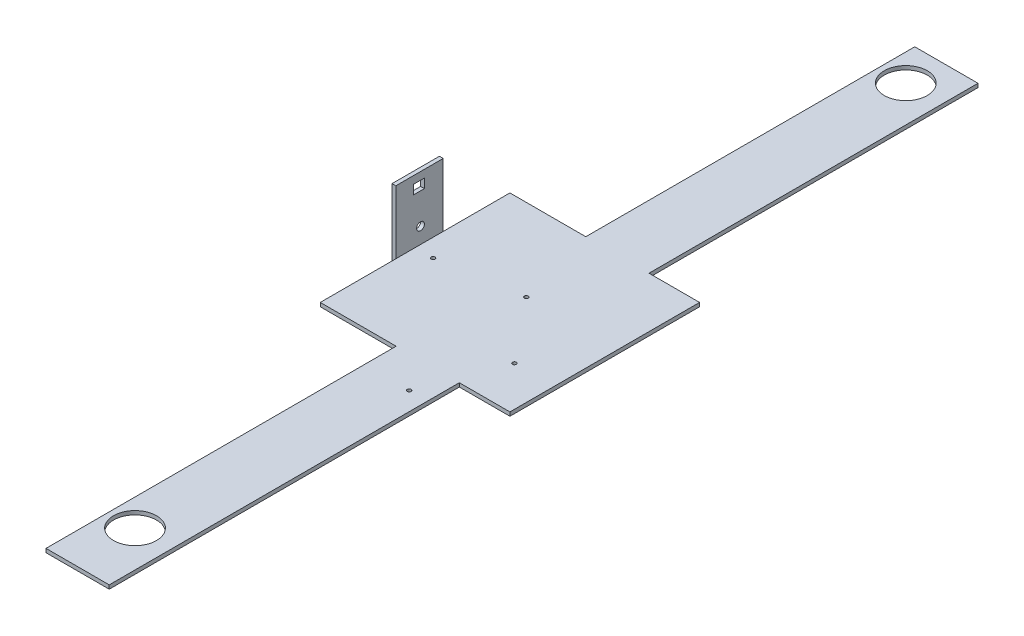
ISO-10303-21;
HEADER;
FILE_DESCRIPTION(('STEP AP214'),'2;1');
FILE_NAME('part.step','',(''),(''),'','','');
FILE_SCHEMA(('AUTOMOTIVE_DESIGN { 1 0 10303 214 1 1 1 1 }'));
ENDSEC;
DATA;
#1=APPLICATION_CONTEXT('core data for automotive mechanical design processes');
#2=APPLICATION_PROTOCOL_DEFINITION('international standard','automotive_design',2000,#1);
#3=PRODUCT_CONTEXT('',#1,'mechanical');
#4=PRODUCT('Part','Part','',(#3));
#5=PRODUCT_RELATED_PRODUCT_CATEGORY('part','',(#4));
#6=PRODUCT_DEFINITION_FORMATION('','',#4);
#7=PRODUCT_DEFINITION_CONTEXT('part definition',#1,'design');
#8=PRODUCT_DEFINITION('design','',#6,#7);
#9=PRODUCT_DEFINITION_SHAPE('','',#8);
#10=(LENGTH_UNIT() NAMED_UNIT(*) SI_UNIT(.MILLI.,.METRE.));
#11=(NAMED_UNIT(*) PLANE_ANGLE_UNIT() SI_UNIT($,.RADIAN.));
#12=(NAMED_UNIT(*) SI_UNIT($,.STERADIAN.) SOLID_ANGLE_UNIT());
#13=UNCERTAINTY_MEASURE_WITH_UNIT(LENGTH_MEASURE(1.E-05),#10,'distance_accuracy_value','');
#14=(GEOMETRIC_REPRESENTATION_CONTEXT(3) GLOBAL_UNCERTAINTY_ASSIGNED_CONTEXT((#13)) GLOBAL_UNIT_ASSIGNED_CONTEXT((#10,
#11,#12)) REPRESENTATION_CONTEXT('',''));
#15=CARTESIAN_POINT('',(0.,0.,0.));
#16=DIRECTION('',(0.,0.,1.));
#17=DIRECTION('',(1.,0.,0.));
#18=AXIS2_PLACEMENT_3D('',#15,#16,#17);
#19=CARTESIAN_POINT('',(-250.4501452919,3.,-142.201168562883));
#20=DIRECTION('',(1.,0.,0.));
#21=DIRECTION('',(0.,0.,-1.));
#22=AXIS2_PLACEMENT_3D('',#19,#20,#21);
#23=PLANE('',#22);
#24=DIRECTION('',(0.,-1.,0.));
#25=VECTOR('',#24,1.);
#26=CARTESIAN_POINT('',(-250.4501452919,0.,-89.4607705671665));
#27=LINE('',#26,#25);
#28=CARTESIAN_POINT('',(-250.4501452919,3.,-89.4607705671665));
#29=VERTEX_POINT('',#28);
#30=CARTESIAN_POINT('',(-250.4501452919,0.,-89.4607705671665));
#31=VERTEX_POINT('',#30);
#32=EDGE_CURVE('E11',#29,#31,#27,.T.);
#33=ORIENTED_EDGE('',*,*,#32,.F.);
#34=DIRECTION('',(0.,0.,1.));
#35=VECTOR('',#34,1.);
#36=CARTESIAN_POINT('',(-250.4501452919,3.,-142.201168562883));
#37=LINE('',#36,#35);
#38=CARTESIAN_POINT('',(-250.4501452919,3.,-142.201168562883));
#39=VERTEX_POINT('',#38);
#40=EDGE_CURVE('E266',#39,#29,#37,.T.);
#41=ORIENTED_EDGE('',*,*,#40,.F.);
#42=DIRECTION('',(0.,-1.,0.));
#43=VECTOR('',#42,1.);
#44=CARTESIAN_POINT('',(-250.4501452919,3.,-142.201168562883));
#45=LINE('',#44,#43);
#46=CARTESIAN_POINT('',(-250.4501452919,0.,-142.201168562883));
#47=VERTEX_POINT('',#46);
#48=EDGE_CURVE('E292',#39,#47,#45,.T.);
#49=ORIENTED_EDGE('',*,*,#48,.T.);
#50=DIRECTION('',(0.,0.,1.));
#51=VECTOR('',#50,1.);
#52=CARTESIAN_POINT('',(-250.4501452919,0.,-142.201168562883));
#53=LINE('',#52,#51);
#54=EDGE_CURVE('E293',#47,#31,#53,.T.);
#55=ORIENTED_EDGE('',*,*,#54,.T.);
#56=EDGE_LOOP('',(#33,#41,#49,#55));
#57=FACE_BOUND('',#56,.T.);
#58=ADVANCED_FACE('F33',(#57),#23,.F.);
#59=DIRECTION('',(0.,1.,0.));
#60=VECTOR('',#59,1.);
#61=CARTESIAN_POINT('',(-250.4501452919,0.,-51.940401143682));
#62=LINE('',#61,#60);
#63=CARTESIAN_POINT('',(-250.4501452919,0.,-51.940401143682));
#64=VERTEX_POINT('',#63);
#65=CARTESIAN_POINT('',(-250.4501452919,3.,-51.940401143682));
#66=VERTEX_POINT('',#65);
#67=EDGE_CURVE('E55',#64,#66,#62,.T.);
#68=ORIENTED_EDGE('',*,*,#67,.F.);
#69=CARTESIAN_POINT('',(-250.4501452919,0.,7.79883143711732));
#70=VERTEX_POINT('',#69);
#71=EDGE_CURVE('E263',#64,#70,#53,.T.);
#72=ORIENTED_EDGE('',*,*,#71,.T.);
#73=DIRECTION('',(0.,-1.,0.));
#74=VECTOR('',#73,1.);
#75=CARTESIAN_POINT('',(-250.4501452919,3.,7.79883143711732));
#76=LINE('',#75,#74);
#77=CARTESIAN_POINT('',(-250.4501452919,3.,7.79883143711732));
#78=VERTEX_POINT('',#77);
#79=EDGE_CURVE('E36',#78,#70,#76,.T.);
#80=ORIENTED_EDGE('',*,*,#79,.F.);
#81=EDGE_CURVE('E270',#66,#78,#37,.T.);
#82=ORIENTED_EDGE('',*,*,#81,.F.);
#83=EDGE_LOOP('',(#68,#72,#80,#82));
#84=FACE_BOUND('',#83,.T.);
#85=ADVANCED_FACE('F358',(#84),#23,.F.);
#86=CARTESIAN_POINT('',(0.,3.,0.));
#87=DIRECTION('',(0.,1.,0.));
#88=DIRECTION('',(0.,0.,1.));
#89=AXIS2_PLACEMENT_3D('',#86,#87,#88);
#90=PLANE('',#89);
#91=CARTESIAN_POINT('',(-155.043904065056,3.,32.8690438600879));
#92=DIRECTION('',(0.,1.,0.));
#93=DIRECTION('',(0.,0.,1.));
#94=AXIS2_PLACEMENT_3D('',#91,#92,#93);
#95=CIRCLE('',#94,1.5);
#96=CARTESIAN_POINT('',(-155.043904065056,3.,34.3690438600879));
#97=VERTEX_POINT('',#96);
#98=EDGE_CURVE('E657',#97,#97,#95,.T.);
#99=ORIENTED_EDGE('',*,*,#98,.F.);
#100=EDGE_LOOP('',(#99));
#101=FACE_BOUND('',#100,.T.);
#102=CARTESIAN_POINT('',(-132.001291311569,3.,-27.290192534707));
#103=DIRECTION('',(0.,1.,0.));
#104=DIRECTION('',(0.,0.,1.));
#105=AXIS2_PLACEMENT_3D('',#102,#103,#104);
#106=CIRCLE('',#105,1.49999999999997);
#107=CARTESIAN_POINT('',(-132.001291311569,3.,-25.790192534707));
#108=VERTEX_POINT('',#107);
#109=EDGE_CURVE('E659',#108,#108,#106,.T.);
#110=ORIENTED_EDGE('',*,*,#109,.F.);
#111=EDGE_LOOP('',(#110));
#112=FACE_BOUND('',#111,.T.);
#113=CARTESIAN_POINT('',(-172.57941192499,3.,-77.3252987461923));
#114=DIRECTION('',(0.,1.,0.));
#115=DIRECTION('',(0.,0.,1.));
#116=AXIS2_PLACEMENT_3D('',#113,#114,#115);
#117=CIRCLE('',#116,1.49999999999999);
#118=CARTESIAN_POINT('',(-172.57941192499,3.,-75.8252987461923));
#119=VERTEX_POINT('',#118);
#120=EDGE_CURVE('E670',#119,#119,#117,.T.);
#121=ORIENTED_EDGE('',*,*,#120,.F.);
#122=EDGE_LOOP('',(#121));
#123=FACE_BOUND('',#122,.T.);
#124=CARTESIAN_POINT('',(-236.2001452919,3.,-67.2011685628827));
#125=DIRECTION('',(0.,1.,0.));
#126=DIRECTION('',(0.,0.,1.));
#127=AXIS2_PLACEMENT_3D('',#124,#125,#126);
#128=CIRCLE('',#127,1.5);
#129=CARTESIAN_POINT('',(-236.2001452919,3.,-65.7011685628827));
#130=VERTEX_POINT('',#129);
#131=EDGE_CURVE('E664',#130,#130,#128,.T.);
#132=ORIENTED_EDGE('',*,*,#131,.F.);
#133=EDGE_LOOP('',(#132));
#134=FACE_BOUND('',#133,.T.);
#135=CARTESIAN_POINT('',(-169.108411929514,3.,-373.953530136649));
#136=DIRECTION('',(0.,1.,0.));
#137=DIRECTION('',(0.,0.,1.));
#138=AXIS2_PLACEMENT_3D('',#135,#136,#137);
#139=CIRCLE('',#138,17.);
#140=CARTESIAN_POINT('',(-169.108411929514,3.,-356.953530136649));
#141=VERTEX_POINT('',#140);
#142=EDGE_CURVE('E260',#141,#141,#139,.T.);
#143=ORIENTED_EDGE('',*,*,#142,.F.);
#144=EDGE_LOOP('',(#143));
#145=FACE_BOUND('',#144,.T.);
#146=ORIENTED_EDGE('',*,*,#40,.T.);
#147=EDGE_CURVE('E269',#29,#66,#37,.T.);
#148=ORIENTED_EDGE('',*,*,#147,.T.);
#149=ORIENTED_EDGE('',*,*,#81,.T.);
#150=DIRECTION('',(1.,0.,0.));
#151=VECTOR('',#150,1.);
#152=CARTESIAN_POINT('',(-250.4501452919,3.,7.79883143711732));
#153=LINE('',#152,#151);
#154=CARTESIAN_POINT('',(-190.4501452919,3.,7.79883143711732));
#155=VERTEX_POINT('',#154);
#156=EDGE_CURVE('E268',#78,#155,#153,.T.);
#157=ORIENTED_EDGE('',*,*,#156,.T.);
#158=DIRECTION('',(0.,0.,1.));
#159=VECTOR('',#158,1.);
#160=CARTESIAN_POINT('',(-190.4501452919,3.,7.79883143711732));
#161=LINE('',#160,#159);
#162=CARTESIAN_POINT('',(-190.4501452919,3.,284.717952363707));
#163=VERTEX_POINT('',#162);
#164=EDGE_CURVE('E272',#155,#163,#161,.T.);
#165=ORIENTED_EDGE('',*,*,#164,.T.);
#166=DIRECTION('',(1.,0.,0.));
#167=VECTOR('',#166,1.);
#168=CARTESIAN_POINT('',(-140.4501452919,3.,284.717952363707));
#169=LINE('',#168,#167);
#170=CARTESIAN_POINT('',(-140.4501452919,3.,284.717952363707));
#171=VERTEX_POINT('',#170);
#172=EDGE_CURVE('E274',#163,#171,#169,.T.);
#173=ORIENTED_EDGE('',*,*,#172,.T.);
#174=DIRECTION('',(0.,0.,-1.));
#175=VECTOR('',#174,1.);
#176=CARTESIAN_POINT('',(-140.4501452919,3.,7.79883143711732));
#177=LINE('',#176,#175);
#178=CARTESIAN_POINT('',(-140.4501452919,3.,7.79883143711732));
#179=VERTEX_POINT('',#178);
#180=EDGE_CURVE('E276',#171,#179,#177,.T.);
#181=ORIENTED_EDGE('',*,*,#180,.T.);
#182=DIRECTION('',(1.,0.,0.));
#183=VECTOR('',#182,1.);
#184=CARTESIAN_POINT('',(-140.4501452919,3.,7.79883143711732));
#185=LINE('',#184,#183);
#186=CARTESIAN_POINT('',(-100.4501452919,3.,7.79883143711732));
#187=VERTEX_POINT('',#186);
#188=EDGE_CURVE('E278',#179,#187,#185,.T.);
#189=ORIENTED_EDGE('',*,*,#188,.T.);
#190=DIRECTION('',(0.,0.,-1.));
#191=VECTOR('',#190,1.);
#192=CARTESIAN_POINT('',(-100.4501452919,3.,-142.201168562883));
#193=LINE('',#192,#191);
#194=CARTESIAN_POINT('',(-100.4501452919,3.,-142.201168562883));
#195=VERTEX_POINT('',#194);
#196=EDGE_CURVE('E280',#187,#195,#193,.T.);
#197=ORIENTED_EDGE('',*,*,#196,.T.);
#198=DIRECTION('',(-1.,0.,0.));
#199=VECTOR('',#198,1.);
#200=CARTESIAN_POINT('',(-140.4501452919,3.,-142.201168562883));
#201=LINE('',#200,#199);
#202=CARTESIAN_POINT('',(-140.4501452919,3.,-142.201168562883));
#203=VERTEX_POINT('',#202);
#204=EDGE_CURVE('E282',#195,#203,#201,.T.);
#205=ORIENTED_EDGE('',*,*,#204,.T.);
#206=DIRECTION('',(0.,0.,-1.));
#207=VECTOR('',#206,1.);
#208=CARTESIAN_POINT('',(-140.4501452919,3.,-142.201168562883));
#209=LINE('',#208,#207);
#210=CARTESIAN_POINT('',(-140.4501452919,3.,-402.408103705192));
#211=VERTEX_POINT('',#210);
#212=EDGE_CURVE('E284',#203,#211,#209,.T.);
#213=ORIENTED_EDGE('',*,*,#212,.T.);
#214=DIRECTION('',(-1.,0.,0.));
#215=VECTOR('',#214,1.);
#216=CARTESIAN_POINT('',(-190.4501452919,3.,-402.408103705192));
#217=LINE('',#216,#215);
#218=CARTESIAN_POINT('',(-190.4501452919,3.,-402.408103705192));
#219=VERTEX_POINT('',#218);
#220=EDGE_CURVE('E286',#211,#219,#217,.T.);
#221=ORIENTED_EDGE('',*,*,#220,.T.);
#222=DIRECTION('',(0.,0.,1.));
#223=VECTOR('',#222,1.);
#224=CARTESIAN_POINT('',(-190.4501452919,3.,-142.201168562883));
#225=LINE('',#224,#223);
#226=CARTESIAN_POINT('',(-190.4501452919,3.,-142.201168562883));
#227=VERTEX_POINT('',#226);
#228=EDGE_CURVE('E288',#219,#227,#225,.T.);
#229=ORIENTED_EDGE('',*,*,#228,.T.);
#230=DIRECTION('',(-1.,0.,0.));
#231=VECTOR('',#230,1.);
#232=CARTESIAN_POINT('',(-190.4501452919,3.,-142.201168562883));
#233=LINE('',#232,#231);
#234=EDGE_CURVE('E290',#227,#39,#233,.T.);
#235=ORIENTED_EDGE('',*,*,#234,.T.);
#236=EDGE_LOOP('',(#146,#148,#149,#157,#165,#173,#181,#189,#197,#205,#213,#221,#229,#235));
#237=FACE_BOUND('',#236,.T.);
#238=CARTESIAN_POINT('',(-169.108411929514,3.,235.646469863352));
#239=DIRECTION('',(0.,1.,0.));
#240=DIRECTION('',(0.,0.,1.));
#241=AXIS2_PLACEMENT_3D('',#238,#239,#240);
#242=CIRCLE('',#241,17.);
#243=CARTESIAN_POINT('',(-169.108411929514,3.,252.646469863352));
#244=VERTEX_POINT('',#243);
#245=EDGE_CURVE('E254',#244,#244,#242,.T.);
#246=ORIENTED_EDGE('',*,*,#245,.F.);
#247=EDGE_LOOP('',(#246));
#248=FACE_BOUND('',#247,.T.);
#249=ADVANCED_FACE('F375',(#101,#112,#123,#134,#145,#237,#248),#90,.T.);
#250=CARTESIAN_POINT('',(0.,0.,0.));
#251=DIRECTION('',(0.,1.,0.));
#252=DIRECTION('',(0.,0.,1.));
#253=AXIS2_PLACEMENT_3D('',#250,#251,#252);
#254=PLANE('',#253);
#255=CARTESIAN_POINT('',(-155.043904065056,0.,32.8690438600879));
#256=DIRECTION('',(0.,1.,0.));
#257=DIRECTION('',(0.,0.,1.));
#258=AXIS2_PLACEMENT_3D('',#255,#256,#257);
#259=CIRCLE('',#258,1.5);
#260=CARTESIAN_POINT('',(-155.043904065056,0.,34.3690438600879));
#261=VERTEX_POINT('',#260);
#262=EDGE_CURVE('E655',#261,#261,#259,.T.);
#263=ORIENTED_EDGE('',*,*,#262,.T.);
#264=EDGE_LOOP('',(#263));
#265=FACE_BOUND('',#264,.T.);
#266=CARTESIAN_POINT('',(-132.001291311569,0.,-27.290192534707));
#267=DIRECTION('',(0.,1.,0.));
#268=DIRECTION('',(0.,0.,1.));
#269=AXIS2_PLACEMENT_3D('',#266,#267,#268);
#270=CIRCLE('',#269,1.49999999999997);
#271=CARTESIAN_POINT('',(-132.001291311569,0.,-25.790192534707));
#272=VERTEX_POINT('',#271);
#273=EDGE_CURVE('E675',#272,#272,#270,.T.);
#274=ORIENTED_EDGE('',*,*,#273,.T.);
#275=EDGE_LOOP('',(#274));
#276=FACE_BOUND('',#275,.T.);
#277=CARTESIAN_POINT('',(-172.57941192499,0.,-77.3252987461923));
#278=DIRECTION('',(0.,1.,0.));
#279=DIRECTION('',(0.,0.,1.));
#280=AXIS2_PLACEMENT_3D('',#277,#278,#279);
#281=CIRCLE('',#280,1.49999999999999);
#282=CARTESIAN_POINT('',(-172.57941192499,0.,-75.8252987461923));
#283=VERTEX_POINT('',#282);
#284=EDGE_CURVE('E666',#283,#283,#281,.T.);
#285=ORIENTED_EDGE('',*,*,#284,.T.);
#286=EDGE_LOOP('',(#285));
#287=FACE_BOUND('',#286,.T.);
#288=CARTESIAN_POINT('',(-236.2001452919,0.,-67.2011685628827));
#289=DIRECTION('',(0.,1.,0.));
#290=DIRECTION('',(0.,0.,1.));
#291=AXIS2_PLACEMENT_3D('',#288,#289,#290);
#292=CIRCLE('',#291,1.5);
#293=CARTESIAN_POINT('',(-236.2001452919,0.,-65.7011685628827));
#294=VERTEX_POINT('',#293);
#295=EDGE_CURVE('E211',#294,#294,#292,.T.);
#296=ORIENTED_EDGE('',*,*,#295,.T.);
#297=EDGE_LOOP('',(#296));
#298=FACE_BOUND('',#297,.T.);
#299=ORIENTED_EDGE('',*,*,#54,.F.);
#300=DIRECTION('',(-1.,0.,0.));
#301=VECTOR('',#300,1.);
#302=CARTESIAN_POINT('',(-250.4501452919,0.,-142.201168562883));
#303=LINE('',#302,#301);
#304=CARTESIAN_POINT('',(-190.4501452919,0.,-142.201168562883));
#305=VERTEX_POINT('',#304);
#306=EDGE_CURVE('E316',#305,#47,#303,.T.);
#307=ORIENTED_EDGE('',*,*,#306,.F.);
#308=DIRECTION('',(0.,0.,1.));
#309=VECTOR('',#308,1.);
#310=CARTESIAN_POINT('',(-190.4501452919,0.,-142.201168562883));
#311=LINE('',#310,#309);
#312=CARTESIAN_POINT('',(-190.4501452919,0.,-402.408103705192));
#313=VERTEX_POINT('',#312);
#314=EDGE_CURVE('E313',#313,#305,#311,.T.);
#315=ORIENTED_EDGE('',*,*,#314,.F.);
#316=DIRECTION('',(-1.,0.,0.));
#317=VECTOR('',#316,1.);
#318=CARTESIAN_POINT('',(-190.4501452919,0.,-402.408103705192));
#319=LINE('',#318,#317);
#320=CARTESIAN_POINT('',(-140.4501452919,0.,-402.408103705192));
#321=VERTEX_POINT('',#320);
#322=EDGE_CURVE('E311',#321,#313,#319,.T.);
#323=ORIENTED_EDGE('',*,*,#322,.F.);
#324=DIRECTION('',(0.,0.,-1.));
#325=VECTOR('',#324,1.);
#326=CARTESIAN_POINT('',(-140.4501452919,0.,-142.201168562883));
#327=LINE('',#326,#325);
#328=CARTESIAN_POINT('',(-140.4501452919,0.,-142.201168562883));
#329=VERTEX_POINT('',#328);
#330=EDGE_CURVE('E309',#329,#321,#327,.T.);
#331=ORIENTED_EDGE('',*,*,#330,.F.);
#332=DIRECTION('',(-1.,0.,0.));
#333=VECTOR('',#332,1.);
#334=CARTESIAN_POINT('',(-140.4501452919,0.,-142.201168562883));
#335=LINE('',#334,#333);
#336=CARTESIAN_POINT('',(-100.4501452919,0.,-142.201168562883));
#337=VERTEX_POINT('',#336);
#338=EDGE_CURVE('E307',#337,#329,#335,.T.);
#339=ORIENTED_EDGE('',*,*,#338,.F.);
#340=DIRECTION('',(0.,0.,-1.));
#341=VECTOR('',#340,1.);
#342=CARTESIAN_POINT('',(-100.4501452919,0.,-142.201168562883));
#343=LINE('',#342,#341);
#344=CARTESIAN_POINT('',(-100.4501452919,0.,7.79883143711732));
#345=VERTEX_POINT('',#344);
#346=EDGE_CURVE('E305',#345,#337,#343,.T.);
#347=ORIENTED_EDGE('',*,*,#346,.F.);
#348=DIRECTION('',(1.,0.,0.));
#349=VECTOR('',#348,1.);
#350=CARTESIAN_POINT('',(-140.4501452919,0.,7.79883143711732));
#351=LINE('',#350,#349);
#352=CARTESIAN_POINT('',(-140.4501452919,0.,7.79883143711732));
#353=VERTEX_POINT('',#352);
#354=EDGE_CURVE('E303',#353,#345,#351,.T.);
#355=ORIENTED_EDGE('',*,*,#354,.F.);
#356=DIRECTION('',(0.,0.,-1.));
#357=VECTOR('',#356,1.);
#358=CARTESIAN_POINT('',(-140.4501452919,0.,7.79883143711732));
#359=LINE('',#358,#357);
#360=CARTESIAN_POINT('',(-140.4501452919,0.,284.717952363707));
#361=VERTEX_POINT('',#360);
#362=EDGE_CURVE('E301',#361,#353,#359,.T.);
#363=ORIENTED_EDGE('',*,*,#362,.F.);
#364=DIRECTION('',(1.,0.,0.));
#365=VECTOR('',#364,1.);
#366=CARTESIAN_POINT('',(-140.4501452919,0.,284.717952363707));
#367=LINE('',#366,#365);
#368=CARTESIAN_POINT('',(-190.4501452919,0.,284.717952363707));
#369=VERTEX_POINT('',#368);
#370=EDGE_CURVE('E299',#369,#361,#367,.T.);
#371=ORIENTED_EDGE('',*,*,#370,.F.);
#372=DIRECTION('',(0.,0.,1.));
#373=VECTOR('',#372,1.);
#374=CARTESIAN_POINT('',(-190.4501452919,0.,7.79883143711732));
#375=LINE('',#374,#373);
#376=CARTESIAN_POINT('',(-190.4501452919,0.,7.79883143711732));
#377=VERTEX_POINT('',#376);
#378=EDGE_CURVE('E297',#377,#369,#375,.T.);
#379=ORIENTED_EDGE('',*,*,#378,.F.);
#380=DIRECTION('',(1.,0.,0.));
#381=VECTOR('',#380,1.);
#382=CARTESIAN_POINT('',(-250.4501452919,0.,7.79883143711732));
#383=LINE('',#382,#381);
#384=EDGE_CURVE('E295',#70,#377,#383,.T.);
#385=ORIENTED_EDGE('',*,*,#384,.F.);
#386=ORIENTED_EDGE('',*,*,#71,.F.);
#387=DIRECTION('',(1.,0.,0.));
#388=VECTOR('',#387,1.);
#389=CARTESIAN_POINT('',(-253.4501452919,0.,-51.940401143682));
#390=LINE('',#389,#388);
#391=CARTESIAN_POINT('',(-253.4501452919,0.,-51.940401143682));
#392=VERTEX_POINT('',#391);
#393=EDGE_CURVE('E247',#392,#64,#390,.T.);
#394=ORIENTED_EDGE('',*,*,#393,.F.);
#395=DIRECTION('',(0.,0.,1.));
#396=VECTOR('',#395,1.);
#397=CARTESIAN_POINT('',(-253.4501452919,0.,-89.4607705671665));
#398=LINE('',#397,#396);
#399=CARTESIAN_POINT('',(-253.4501452919,0.,-89.4607705671665));
#400=VERTEX_POINT('',#399);
#401=EDGE_CURVE('E230',#400,#392,#398,.T.);
#402=ORIENTED_EDGE('',*,*,#401,.F.);
#403=DIRECTION('',(1.,0.,0.));
#404=VECTOR('',#403,1.);
#405=CARTESIAN_POINT('',(-253.4501452919,0.,-89.4607705671665));
#406=LINE('',#405,#404);
#407=EDGE_CURVE('E250',#400,#31,#406,.T.);
#408=ORIENTED_EDGE('',*,*,#407,.T.);
#409=EDGE_LOOP('',(#299,#307,#315,#323,#331,#339,#347,#355,#363,#371,#379,#385,#386,#394,#402,#408));
#410=FACE_BOUND('',#409,.T.);
#411=CARTESIAN_POINT('',(-169.108411929514,0.,-373.953530136649));
#412=DIRECTION('',(0.,1.,0.));
#413=DIRECTION('',(0.,0.,1.));
#414=AXIS2_PLACEMENT_3D('',#411,#412,#413);
#415=CIRCLE('',#414,17.);
#416=CARTESIAN_POINT('',(-169.108411929514,0.,-356.953530136649));
#417=VERTEX_POINT('',#416);
#418=EDGE_CURVE('E257',#417,#417,#415,.T.);
#419=ORIENTED_EDGE('',*,*,#418,.T.);
#420=EDGE_LOOP('',(#419));
#421=FACE_BOUND('',#420,.T.);
#422=CARTESIAN_POINT('',(-169.108411929514,0.,235.646469863352));
#423=DIRECTION('',(0.,1.,0.));
#424=DIRECTION('',(0.,0.,1.));
#425=AXIS2_PLACEMENT_3D('',#422,#423,#424);
#426=CIRCLE('',#425,17.);
#427=CARTESIAN_POINT('',(-169.108411929514,0.,252.646469863352));
#428=VERTEX_POINT('',#427);
#429=EDGE_CURVE('E253',#428,#428,#426,.T.);
#430=ORIENTED_EDGE('',*,*,#429,.T.);
#431=EDGE_LOOP('',(#430));
#432=FACE_BOUND('',#431,.T.);
#433=ADVANCED_FACE('F363',(#265,#276,#287,#298,#410,#421,#432),#254,.F.);
#434=CARTESIAN_POINT('',(-250.4501452919,3.,7.79883143711732));
#435=DIRECTION('',(0.,0.,-1.));
#436=DIRECTION('',(-1.,0.,0.));
#437=AXIS2_PLACEMENT_3D('',#434,#435,#436);
#438=PLANE('',#437);
#439=ORIENTED_EDGE('',*,*,#384,.T.);
#440=DIRECTION('',(0.,-1.,0.));
#441=VECTOR('',#440,1.);
#442=CARTESIAN_POINT('',(-190.4501452919,3.,7.79883143711732));
#443=LINE('',#442,#441);
#444=EDGE_CURVE('E346',#155,#377,#443,.T.);
#445=ORIENTED_EDGE('',*,*,#444,.F.);
#446=ORIENTED_EDGE('',*,*,#156,.F.);
#447=ORIENTED_EDGE('',*,*,#79,.T.);
#448=EDGE_LOOP('',(#439,#445,#446,#447));
#449=FACE_BOUND('',#448,.T.);
#450=ADVANCED_FACE('F356',(#449),#438,.F.);
#451=CARTESIAN_POINT('',(-190.4501452919,3.,7.79883143711732));
#452=DIRECTION('',(1.,0.,0.));
#453=DIRECTION('',(0.,0.,-1.));
#454=AXIS2_PLACEMENT_3D('',#451,#452,#453);
#455=PLANE('',#454);
#456=ORIENTED_EDGE('',*,*,#378,.T.);
#457=DIRECTION('',(0.,-1.,0.));
#458=VECTOR('',#457,1.);
#459=CARTESIAN_POINT('',(-190.4501452919,3.,284.717952363707));
#460=LINE('',#459,#458);
#461=EDGE_CURVE('E344',#163,#369,#460,.T.);
#462=ORIENTED_EDGE('',*,*,#461,.F.);
#463=ORIENTED_EDGE('',*,*,#164,.F.);
#464=ORIENTED_EDGE('',*,*,#444,.T.);
#465=EDGE_LOOP('',(#456,#462,#463,#464));
#466=FACE_BOUND('',#465,.T.);
#467=ADVANCED_FACE('F368',(#466),#455,.F.);
#468=CARTESIAN_POINT('',(-140.4501452919,3.,284.717952363707));
#469=DIRECTION('',(0.,0.,-1.));
#470=DIRECTION('',(-1.,0.,0.));
#471=AXIS2_PLACEMENT_3D('',#468,#469,#470);
#472=PLANE('',#471);
#473=ORIENTED_EDGE('',*,*,#370,.T.);
#474=DIRECTION('',(0.,-1.,0.));
#475=VECTOR('',#474,1.);
#476=CARTESIAN_POINT('',(-140.4501452919,3.,284.717952363707));
#477=LINE('',#476,#475);
#478=EDGE_CURVE('E341',#171,#361,#477,.T.);
#479=ORIENTED_EDGE('',*,*,#478,.F.);
#480=ORIENTED_EDGE('',*,*,#172,.F.);
#481=ORIENTED_EDGE('',*,*,#461,.T.);
#482=EDGE_LOOP('',(#473,#479,#480,#481));
#483=FACE_BOUND('',#482,.T.);
#484=ADVANCED_FACE('F371',(#483),#472,.F.);
#485=CARTESIAN_POINT('',(-140.4501452919,3.,7.79883143711732));
#486=DIRECTION('',(-1.,0.,0.));
#487=DIRECTION('',(0.,0.,1.));
#488=AXIS2_PLACEMENT_3D('',#485,#486,#487);
#489=PLANE('',#488);
#490=ORIENTED_EDGE('',*,*,#362,.T.);
#491=DIRECTION('',(0.,-1.,0.));
#492=VECTOR('',#491,1.);
#493=CARTESIAN_POINT('',(-140.4501452919,3.,7.79883143711732));
#494=LINE('',#493,#492);
#495=EDGE_CURVE('E338',#179,#353,#494,.T.);
#496=ORIENTED_EDGE('',*,*,#495,.F.);
#497=ORIENTED_EDGE('',*,*,#180,.F.);
#498=ORIENTED_EDGE('',*,*,#478,.T.);
#499=EDGE_LOOP('',(#490,#496,#497,#498));
#500=FACE_BOUND('',#499,.T.);
#501=ADVANCED_FACE('F456',(#500),#489,.F.);
#502=CARTESIAN_POINT('',(-140.4501452919,3.,7.79883143711732));
#503=DIRECTION('',(0.,0.,-1.));
#504=DIRECTION('',(-1.,0.,0.));
#505=AXIS2_PLACEMENT_3D('',#502,#503,#504);
#506=PLANE('',#505);
#507=ORIENTED_EDGE('',*,*,#354,.T.);
#508=DIRECTION('',(0.,-1.,0.));
#509=VECTOR('',#508,1.);
#510=CARTESIAN_POINT('',(-100.4501452919,3.,7.79883143711732));
#511=LINE('',#510,#509);
#512=EDGE_CURVE('E335',#187,#345,#511,.T.);
#513=ORIENTED_EDGE('',*,*,#512,.F.);
#514=ORIENTED_EDGE('',*,*,#188,.F.);
#515=ORIENTED_EDGE('',*,*,#495,.T.);
#516=EDGE_LOOP('',(#507,#513,#514,#515));
#517=FACE_BOUND('',#516,.T.);
#518=ADVANCED_FACE('F452',(#517),#506,.F.);
#519=CARTESIAN_POINT('',(-100.4501452919,3.,-142.201168562883));
#520=DIRECTION('',(-1.,0.,0.));
#521=DIRECTION('',(0.,0.,1.));
#522=AXIS2_PLACEMENT_3D('',#519,#520,#521);
#523=PLANE('',#522);
#524=ORIENTED_EDGE('',*,*,#346,.T.);
#525=DIRECTION('',(0.,-1.,0.));
#526=VECTOR('',#525,1.);
#527=CARTESIAN_POINT('',(-100.4501452919,3.,-142.201168562883));
#528=LINE('',#527,#526);
#529=EDGE_CURVE('E332',#195,#337,#528,.T.);
#530=ORIENTED_EDGE('',*,*,#529,.F.);
#531=ORIENTED_EDGE('',*,*,#196,.F.);
#532=ORIENTED_EDGE('',*,*,#512,.T.);
#533=EDGE_LOOP('',(#524,#530,#531,#532));
#534=FACE_BOUND('',#533,.T.);
#535=ADVANCED_FACE('F448',(#534),#523,.F.);
#536=CARTESIAN_POINT('',(-140.4501452919,3.,-142.201168562883));
#537=DIRECTION('',(0.,0.,1.));
#538=DIRECTION('',(1.,0.,0.));
#539=AXIS2_PLACEMENT_3D('',#536,#537,#538);
#540=PLANE('',#539);
#541=ORIENTED_EDGE('',*,*,#338,.T.);
#542=DIRECTION('',(0.,-1.,0.));
#543=VECTOR('',#542,1.);
#544=CARTESIAN_POINT('',(-140.4501452919,3.,-142.201168562883));
#545=LINE('',#544,#543);
#546=EDGE_CURVE('E329',#203,#329,#545,.T.);
#547=ORIENTED_EDGE('',*,*,#546,.F.);
#548=ORIENTED_EDGE('',*,*,#204,.F.);
#549=ORIENTED_EDGE('',*,*,#529,.T.);
#550=EDGE_LOOP('',(#541,#547,#548,#549));
#551=FACE_BOUND('',#550,.T.);
#552=ADVANCED_FACE('F444',(#551),#540,.F.);
#553=CARTESIAN_POINT('',(-140.4501452919,3.,-142.201168562883));
#554=DIRECTION('',(-1.,0.,0.));
#555=DIRECTION('',(0.,0.,1.));
#556=AXIS2_PLACEMENT_3D('',#553,#554,#555);
#557=PLANE('',#556);
#558=ORIENTED_EDGE('',*,*,#330,.T.);
#559=DIRECTION('',(0.,-1.,0.));
#560=VECTOR('',#559,1.);
#561=CARTESIAN_POINT('',(-140.4501452919,3.,-402.408103705192));
#562=LINE('',#561,#560);
#563=EDGE_CURVE('E326',#211,#321,#562,.T.);
#564=ORIENTED_EDGE('',*,*,#563,.F.);
#565=ORIENTED_EDGE('',*,*,#212,.F.);
#566=ORIENTED_EDGE('',*,*,#546,.T.);
#567=EDGE_LOOP('',(#558,#564,#565,#566));
#568=FACE_BOUND('',#567,.T.);
#569=ADVANCED_FACE('F440',(#568),#557,.F.);
#570=CARTESIAN_POINT('',(-190.4501452919,3.,-402.408103705192));
#571=DIRECTION('',(0.,0.,1.));
#572=DIRECTION('',(1.,0.,0.));
#573=AXIS2_PLACEMENT_3D('',#570,#571,#572);
#574=PLANE('',#573);
#575=ORIENTED_EDGE('',*,*,#322,.T.);
#576=DIRECTION('',(0.,-1.,0.));
#577=VECTOR('',#576,1.);
#578=CARTESIAN_POINT('',(-190.4501452919,3.,-402.408103705192));
#579=LINE('',#578,#577);
#580=EDGE_CURVE('E323',#219,#313,#579,.T.);
#581=ORIENTED_EDGE('',*,*,#580,.F.);
#582=ORIENTED_EDGE('',*,*,#220,.F.);
#583=ORIENTED_EDGE('',*,*,#563,.T.);
#584=EDGE_LOOP('',(#575,#581,#582,#583));
#585=FACE_BOUND('',#584,.T.);
#586=ADVANCED_FACE('F436',(#585),#574,.F.);
#587=CARTESIAN_POINT('',(-190.4501452919,3.,-142.201168562883));
#588=DIRECTION('',(1.,0.,0.));
#589=DIRECTION('',(0.,0.,-1.));
#590=AXIS2_PLACEMENT_3D('',#587,#588,#589);
#591=PLANE('',#590);
#592=ORIENTED_EDGE('',*,*,#314,.T.);
#593=DIRECTION('',(0.,-1.,0.));
#594=VECTOR('',#593,1.);
#595=CARTESIAN_POINT('',(-190.4501452919,3.,-142.201168562883));
#596=LINE('',#595,#594);
#597=EDGE_CURVE('E320',#227,#305,#596,.T.);
#598=ORIENTED_EDGE('',*,*,#597,.F.);
#599=ORIENTED_EDGE('',*,*,#228,.F.);
#600=ORIENTED_EDGE('',*,*,#580,.T.);
#601=EDGE_LOOP('',(#592,#598,#599,#600));
#602=FACE_BOUND('',#601,.T.);
#603=ADVANCED_FACE('F432',(#602),#591,.F.);
#604=CARTESIAN_POINT('',(-250.4501452919,3.,-142.201168562883));
#605=DIRECTION('',(0.,0.,1.));
#606=DIRECTION('',(1.,0.,0.));
#607=AXIS2_PLACEMENT_3D('',#604,#605,#606);
#608=PLANE('',#607);
#609=ORIENTED_EDGE('',*,*,#306,.T.);
#610=ORIENTED_EDGE('',*,*,#48,.F.);
#611=ORIENTED_EDGE('',*,*,#234,.F.);
#612=ORIENTED_EDGE('',*,*,#597,.T.);
#613=EDGE_LOOP('',(#609,#610,#611,#612));
#614=FACE_BOUND('',#613,.T.);
#615=ADVANCED_FACE('F429',(#614),#608,.F.);
#616=CARTESIAN_POINT('',(-169.108411929514,3.,-373.953530136649));
#617=DIRECTION('',(0.,-1.,0.));
#618=DIRECTION('',(0.,0.,-1.));
#619=AXIS2_PLACEMENT_3D('',#616,#617,#618);
#620=CYLINDRICAL_SURFACE('',#619,17.);
#621=ORIENTED_EDGE('',*,*,#142,.T.);
#622=EDGE_LOOP('',(#621));
#623=FACE_BOUND('',#622,.T.);
#624=ORIENTED_EDGE('',*,*,#418,.F.);
#625=EDGE_LOOP('',(#624));
#626=FACE_BOUND('',#625,.T.);
#627=ADVANCED_FACE('F426',(#623,#626),#620,.F.);
#628=CARTESIAN_POINT('',(-169.108411929514,3.,235.646469863352));
#629=DIRECTION('',(0.,-1.,0.));
#630=DIRECTION('',(0.,0.,-1.));
#631=AXIS2_PLACEMENT_3D('',#628,#629,#630);
#632=CYLINDRICAL_SURFACE('',#631,17.);
#633=ORIENTED_EDGE('',*,*,#245,.T.);
#634=EDGE_LOOP('',(#633));
#635=FACE_BOUND('',#634,.T.);
#636=ORIENTED_EDGE('',*,*,#429,.F.);
#637=EDGE_LOOP('',(#636));
#638=FACE_BOUND('',#637,.T.);
#639=ADVANCED_FACE('F404',(#635,#638),#632,.F.);
#640=CARTESIAN_POINT('',(-250.4501452919,0.,-3.70539419115827E-13));
#641=DIRECTION('',(1.,0.,0.));
#642=DIRECTION('',(0.,0.,-1.));
#643=AXIS2_PLACEMENT_3D('',#640,#641,#642);
#644=PLANE('',#643);
#645=DIRECTION('',(0.,0.,-1.));
#646=VECTOR('',#645,1.);
#647=CARTESIAN_POINT('',(-250.4501452919,47.0141922059852,-74.5662897153155));
#648=LINE('',#647,#646);
#649=CARTESIAN_POINT('',(-250.4501452919,47.0141922059852,-66.1343491062355));
#650=VERTEX_POINT('',#649);
#651=CARTESIAN_POINT('',(-250.4501452919,47.0141922059852,-74.5662897153155));
#652=VERTEX_POINT('',#651);
#653=EDGE_CURVE('E189',#650,#652,#648,.T.);
#654=ORIENTED_EDGE('',*,*,#653,.T.);
#655=DIRECTION('',(0.,-1.,0.));
#656=VECTOR('',#655,1.);
#657=CARTESIAN_POINT('',(-250.4501452919,47.0141922059852,-74.5662897153155));
#658=LINE('',#657,#656);
#659=CARTESIAN_POINT('',(-250.4501452919,39.7713085561371,-74.5662897153155));
#660=VERTEX_POINT('',#659);
#661=EDGE_CURVE('E209',#652,#660,#658,.T.);
#662=ORIENTED_EDGE('',*,*,#661,.T.);
#663=DIRECTION('',(0.,0.,1.));
#664=VECTOR('',#663,1.);
#665=CARTESIAN_POINT('',(-250.4501452919,39.7713085561371,-74.5662897153155));
#666=LINE('',#665,#664);
#667=CARTESIAN_POINT('',(-250.4501452919,39.7713085561371,-66.1343491062355));
#668=VERTEX_POINT('',#667);
#669=EDGE_CURVE('E195',#660,#668,#666,.T.);
#670=ORIENTED_EDGE('',*,*,#669,.T.);
#671=DIRECTION('',(0.,1.,0.));
#672=VECTOR('',#671,1.);
#673=CARTESIAN_POINT('',(-250.4501452919,47.0141922059852,-66.1343491062355));
#674=LINE('',#673,#672);
#675=EDGE_CURVE('E213',#668,#650,#674,.T.);
#676=ORIENTED_EDGE('',*,*,#675,.T.);
#677=EDGE_LOOP('',(#654,#662,#670,#676));
#678=FACE_BOUND('',#677,.T.);
#679=CARTESIAN_POINT('',(-250.4501452919,15.5173653857723,-71.4851739463306));
#680=DIRECTION('',(-1.,0.,0.));
#681=DIRECTION('',(0.,0.,1.));
#682=AXIS2_PLACEMENT_3D('',#679,#680,#681);
#683=CIRCLE('',#682,3.08111576898487);
#684=CARTESIAN_POINT('',(-250.4501452919,15.5173653857723,-68.4040581773458));
#685=VERTEX_POINT('',#684);
#686=EDGE_CURVE('E196',#685,#685,#683,.T.);
#687=ORIENTED_EDGE('',*,*,#686,.T.);
#688=EDGE_LOOP('',(#687));
#689=FACE_BOUND('',#688,.T.);
#690=ORIENTED_EDGE('',*,*,#147,.F.);
#691=CARTESIAN_POINT('',(-250.4501452919,53.,-89.4607705671665));
#692=VERTEX_POINT('',#691);
#693=EDGE_CURVE('E42',#692,#29,#27,.T.);
#694=ORIENTED_EDGE('',*,*,#693,.F.);
#695=DIRECTION('',(0.,0.,-1.));
#696=VECTOR('',#695,1.);
#697=CARTESIAN_POINT('',(-250.4501452919,53.,-89.4607705671665));
#698=LINE('',#697,#696);
#699=CARTESIAN_POINT('',(-250.4501452919,53.,-51.940401143682));
#700=VERTEX_POINT('',#699);
#701=EDGE_CURVE('E231',#700,#692,#698,.T.);
#702=ORIENTED_EDGE('',*,*,#701,.F.);
#703=EDGE_CURVE('E239',#66,#700,#62,.T.);
#704=ORIENTED_EDGE('',*,*,#703,.F.);
#705=EDGE_LOOP('',(#690,#694,#702,#704));
#706=FACE_BOUND('',#705,.T.);
#707=ADVANCED_FACE('F381',(#678,#689,#706),#644,.T.);
#708=CARTESIAN_POINT('',(-253.4501452919,0.,-3.71649642140452E-13));
#709=DIRECTION('',(1.,0.,0.));
#710=DIRECTION('',(0.,0.,-1.));
#711=AXIS2_PLACEMENT_3D('',#708,#709,#710);
#712=PLANE('',#711);
#713=CARTESIAN_POINT('',(-253.4501452919,15.5173653857723,-71.4851739463306));
#714=DIRECTION('',(-1.,0.,0.));
#715=DIRECTION('',(0.,0.,1.));
#716=AXIS2_PLACEMENT_3D('',#713,#714,#715);
#717=CIRCLE('',#716,3.08111576898487);
#718=CARTESIAN_POINT('',(-253.4501452919,15.5173653857723,-68.4040581773458));
#719=VERTEX_POINT('',#718);
#720=EDGE_CURVE('E222',#719,#719,#717,.T.);
#721=ORIENTED_EDGE('',*,*,#720,.F.);
#722=EDGE_LOOP('',(#721));
#723=FACE_BOUND('',#722,.T.);
#724=DIRECTION('',(0.,-1.,0.));
#725=VECTOR('',#724,1.);
#726=CARTESIAN_POINT('',(-253.4501452919,0.,-89.4607705671665));
#727=LINE('',#726,#725);
#728=CARTESIAN_POINT('',(-253.4501452919,53.,-89.4607705671665));
#729=VERTEX_POINT('',#728);
#730=EDGE_CURVE('E227',#729,#400,#727,.T.);
#731=ORIENTED_EDGE('',*,*,#730,.T.);
#732=ORIENTED_EDGE('',*,*,#401,.T.);
#733=DIRECTION('',(0.,1.,0.));
#734=VECTOR('',#733,1.);
#735=CARTESIAN_POINT('',(-253.4501452919,0.,-51.940401143682));
#736=LINE('',#735,#734);
#737=CARTESIAN_POINT('',(-253.4501452919,53.,-51.940401143682));
#738=VERTEX_POINT('',#737);
#739=EDGE_CURVE('E233',#392,#738,#736,.T.);
#740=ORIENTED_EDGE('',*,*,#739,.T.);
#741=DIRECTION('',(0.,0.,-1.));
#742=VECTOR('',#741,1.);
#743=CARTESIAN_POINT('',(-253.4501452919,53.,-89.4607705671665));
#744=LINE('',#743,#742);
#745=EDGE_CURVE('E235',#738,#729,#744,.T.);
#746=ORIENTED_EDGE('',*,*,#745,.T.);
#747=EDGE_LOOP('',(#731,#732,#740,#746));
#748=FACE_BOUND('',#747,.T.);
#749=DIRECTION('',(0.,-1.,0.));
#750=VECTOR('',#749,1.);
#751=CARTESIAN_POINT('',(-253.4501452919,47.0141922059852,-74.5662897153155));
#752=LINE('',#751,#750);
#753=CARTESIAN_POINT('',(-253.4501452919,47.0141922059852,-74.5662897153155));
#754=VERTEX_POINT('',#753);
#755=CARTESIAN_POINT('',(-253.4501452919,39.7713085561371,-74.5662897153155));
#756=VERTEX_POINT('',#755);
#757=EDGE_CURVE('E178',#754,#756,#752,.T.);
#758=ORIENTED_EDGE('',*,*,#757,.F.);
#759=DIRECTION('',(0.,0.,-1.));
#760=VECTOR('',#759,1.);
#761=CARTESIAN_POINT('',(-253.4501452919,47.0141922059852,-74.5662897153155));
#762=LINE('',#761,#760);
#763=CARTESIAN_POINT('',(-253.4501452919,47.0141922059852,-66.1343491062355));
#764=VERTEX_POINT('',#763);
#765=EDGE_CURVE('E204',#764,#754,#762,.T.);
#766=ORIENTED_EDGE('',*,*,#765,.F.);
#767=DIRECTION('',(0.,1.,0.));
#768=VECTOR('',#767,1.);
#769=CARTESIAN_POINT('',(-253.4501452919,47.0141922059852,-66.1343491062355));
#770=LINE('',#769,#768);
#771=CARTESIAN_POINT('',(-253.4501452919,39.7713085561371,-66.1343491062355));
#772=VERTEX_POINT('',#771);
#773=EDGE_CURVE('E202',#772,#764,#770,.T.);
#774=ORIENTED_EDGE('',*,*,#773,.F.);
#775=DIRECTION('',(0.,0.,1.));
#776=VECTOR('',#775,1.);
#777=CARTESIAN_POINT('',(-253.4501452919,39.7713085561371,-74.5662897153155));
#778=LINE('',#777,#776);
#779=EDGE_CURVE('E188',#756,#772,#778,.T.);
#780=ORIENTED_EDGE('',*,*,#779,.F.);
#781=EDGE_LOOP('',(#758,#766,#774,#780));
#782=FACE_BOUND('',#781,.T.);
#783=ADVANCED_FACE('F200',(#723,#748,#782),#712,.F.);
#784=CARTESIAN_POINT('',(-253.4501452919,0.,-89.4607705671665));
#785=DIRECTION('',(0.,0.,1.));
#786=DIRECTION('',(1.,0.,0.));
#787=AXIS2_PLACEMENT_3D('',#784,#785,#786);
#788=PLANE('',#787);
#789=ORIENTED_EDGE('',*,*,#693,.T.);
#790=ORIENTED_EDGE('',*,*,#32,.T.);
#791=ORIENTED_EDGE('',*,*,#407,.F.);
#792=ORIENTED_EDGE('',*,*,#730,.F.);
#793=DIRECTION('',(1.,0.,0.));
#794=VECTOR('',#793,1.);
#795=CARTESIAN_POINT('',(-253.4501452919,53.,-89.4607705671665));
#796=LINE('',#795,#794);
#797=EDGE_CURVE('E236',#729,#692,#796,.T.);
#798=ORIENTED_EDGE('',*,*,#797,.T.);
#799=EDGE_LOOP('',(#789,#790,#791,#792,#798));
#800=FACE_BOUND('',#799,.T.);
#801=ADVANCED_FACE('F384',(#800),#788,.F.);
#802=CARTESIAN_POINT('',(-253.4501452919,0.,-51.940401143682));
#803=DIRECTION('',(0.,0.,-1.));
#804=DIRECTION('',(-1.,0.,0.));
#805=AXIS2_PLACEMENT_3D('',#802,#803,#804);
#806=PLANE('',#805);
#807=ORIENTED_EDGE('',*,*,#67,.T.);
#808=ORIENTED_EDGE('',*,*,#703,.T.);
#809=DIRECTION('',(1.,0.,0.));
#810=VECTOR('',#809,1.);
#811=CARTESIAN_POINT('',(-253.4501452919,53.,-51.940401143682));
#812=LINE('',#811,#810);
#813=EDGE_CURVE('E244',#738,#700,#812,.T.);
#814=ORIENTED_EDGE('',*,*,#813,.F.);
#815=ORIENTED_EDGE('',*,*,#739,.F.);
#816=ORIENTED_EDGE('',*,*,#393,.T.);
#817=EDGE_LOOP('',(#807,#808,#814,#815,#816));
#818=FACE_BOUND('',#817,.T.);
#819=ADVANCED_FACE('F394',(#818),#806,.F.);
#820=CARTESIAN_POINT('',(-253.4501452919,53.,-89.4607705671665));
#821=DIRECTION('',(0.,-1.,0.));
#822=DIRECTION('',(0.,0.,-1.));
#823=AXIS2_PLACEMENT_3D('',#820,#821,#822);
#824=PLANE('',#823);
#825=ORIENTED_EDGE('',*,*,#701,.T.);
#826=ORIENTED_EDGE('',*,*,#797,.F.);
#827=ORIENTED_EDGE('',*,*,#745,.F.);
#828=ORIENTED_EDGE('',*,*,#813,.T.);
#829=EDGE_LOOP('',(#825,#826,#827,#828));
#830=FACE_BOUND('',#829,.T.);
#831=ADVANCED_FACE('F390',(#830),#824,.F.);
#832=CARTESIAN_POINT('',(-253.4501452919,15.5173653857723,-71.4851739463306));
#833=DIRECTION('',(1.,0.,0.));
#834=DIRECTION('',(0.,0.,-1.));
#835=AXIS2_PLACEMENT_3D('',#832,#833,#834);
#836=CYLINDRICAL_SURFACE('',#835,3.08111576898487);
#837=ORIENTED_EDGE('',*,*,#720,.T.);
#838=EDGE_LOOP('',(#837));
#839=FACE_BOUND('',#838,.T.);
#840=ORIENTED_EDGE('',*,*,#686,.F.);
#841=EDGE_LOOP('',(#840));
#842=FACE_BOUND('',#841,.T.);
#843=ADVANCED_FACE('F555',(#839,#842),#836,.F.);
#844=CARTESIAN_POINT('',(-253.4501452919,47.0141922059852,-74.5662897153155));
#845=DIRECTION('',(0.,0.,1.));
#846=DIRECTION('',(1.,0.,0.));
#847=AXIS2_PLACEMENT_3D('',#844,#845,#846);
#848=PLANE('',#847);
#849=ORIENTED_EDGE('',*,*,#661,.F.);
#850=DIRECTION('',(1.,0.,0.));
#851=VECTOR('',#850,1.);
#852=CARTESIAN_POINT('',(-253.4501452919,47.0141922059852,-74.5662897153155));
#853=LINE('',#852,#851);
#854=EDGE_CURVE('E184',#754,#652,#853,.T.);
#855=ORIENTED_EDGE('',*,*,#854,.F.);
#856=ORIENTED_EDGE('',*,*,#757,.T.);
#857=DIRECTION('',(1.,0.,0.));
#858=VECTOR('',#857,1.);
#859=CARTESIAN_POINT('',(-253.4501452919,39.7713085561371,-74.5662897153155));
#860=LINE('',#859,#858);
#861=EDGE_CURVE('E181',#756,#660,#860,.T.);
#862=ORIENTED_EDGE('',*,*,#861,.T.);
#863=EDGE_LOOP('',(#849,#855,#856,#862));
#864=FACE_BOUND('',#863,.T.);
#865=ADVANCED_FACE('F180',(#864),#848,.T.);
#866=CARTESIAN_POINT('',(-253.4501452919,39.7713085561371,-74.5662897153155));
#867=DIRECTION('',(0.,1.,0.));
#868=DIRECTION('',(0.,0.,1.));
#869=AXIS2_PLACEMENT_3D('',#866,#867,#868);
#870=PLANE('',#869);
#871=ORIENTED_EDGE('',*,*,#669,.F.);
#872=ORIENTED_EDGE('',*,*,#861,.F.);
#873=ORIENTED_EDGE('',*,*,#779,.T.);
#874=DIRECTION('',(1.,0.,0.));
#875=VECTOR('',#874,1.);
#876=CARTESIAN_POINT('',(-253.4501452919,39.7713085561371,-66.1343491062355));
#877=LINE('',#876,#875);
#878=EDGE_CURVE('E197',#772,#668,#877,.T.);
#879=ORIENTED_EDGE('',*,*,#878,.T.);
#880=EDGE_LOOP('',(#871,#872,#873,#879));
#881=FACE_BOUND('',#880,.T.);
#882=ADVANCED_FACE('F192',(#881),#870,.T.);
#883=CARTESIAN_POINT('',(-253.4501452919,47.0141922059852,-66.1343491062355));
#884=DIRECTION('',(0.,0.,-1.));
#885=DIRECTION('',(-1.,0.,0.));
#886=AXIS2_PLACEMENT_3D('',#883,#884,#885);
#887=PLANE('',#886);
#888=ORIENTED_EDGE('',*,*,#675,.F.);
#889=ORIENTED_EDGE('',*,*,#878,.F.);
#890=ORIENTED_EDGE('',*,*,#773,.T.);
#891=DIRECTION('',(1.,0.,0.));
#892=VECTOR('',#891,1.);
#893=CARTESIAN_POINT('',(-253.4501452919,47.0141922059852,-66.1343491062355));
#894=LINE('',#893,#892);
#895=EDGE_CURVE('E219',#764,#650,#894,.T.);
#896=ORIENTED_EDGE('',*,*,#895,.T.);
#897=EDGE_LOOP('',(#888,#889,#890,#896));
#898=FACE_BOUND('',#897,.T.);
#899=ADVANCED_FACE('F580',(#898),#887,.T.);
#900=CARTESIAN_POINT('',(-253.4501452919,47.0141922059852,-74.5662897153155));
#901=DIRECTION('',(0.,-1.,0.));
#902=DIRECTION('',(0.,0.,-1.));
#903=AXIS2_PLACEMENT_3D('',#900,#901,#902);
#904=PLANE('',#903);
#905=ORIENTED_EDGE('',*,*,#653,.F.);
#906=ORIENTED_EDGE('',*,*,#895,.F.);
#907=ORIENTED_EDGE('',*,*,#765,.T.);
#908=ORIENTED_EDGE('',*,*,#854,.T.);
#909=EDGE_LOOP('',(#905,#906,#907,#908));
#910=FACE_BOUND('',#909,.T.);
#911=ADVANCED_FACE('F589',(#910),#904,.T.);
#912=CARTESIAN_POINT('',(-236.2001452919,0.,-67.2011685628827));
#913=DIRECTION('',(0.,1.,0.));
#914=DIRECTION('',(0.,0.,1.));
#915=AXIS2_PLACEMENT_3D('',#912,#913,#914);
#916=CYLINDRICAL_SURFACE('',#915,1.5);
#917=ORIENTED_EDGE('',*,*,#295,.F.);
#918=EDGE_LOOP('',(#917));
#919=FACE_BOUND('',#918,.T.);
#920=ORIENTED_EDGE('',*,*,#131,.T.);
#921=EDGE_LOOP('',(#920));
#922=FACE_BOUND('',#921,.T.);
#923=ADVANCED_FACE('F598',(#919,#922),#916,.F.);
#924=CARTESIAN_POINT('',(-172.57941192499,0.,-77.3252987461923));
#925=DIRECTION('',(0.,1.,0.));
#926=DIRECTION('',(0.,0.,1.));
#927=AXIS2_PLACEMENT_3D('',#924,#925,#926);
#928=CYLINDRICAL_SURFACE('',#927,1.49999999999999);
#929=ORIENTED_EDGE('',*,*,#284,.F.);
#930=EDGE_LOOP('',(#929));
#931=FACE_BOUND('',#930,.T.);
#932=ORIENTED_EDGE('',*,*,#120,.T.);
#933=EDGE_LOOP('',(#932));
#934=FACE_BOUND('',#933,.T.);
#935=ADVANCED_FACE('F618',(#931,#934),#928,.F.);
#936=CARTESIAN_POINT('',(-132.001291311569,0.,-27.290192534707));
#937=DIRECTION('',(0.,1.,0.));
#938=DIRECTION('',(0.,0.,1.));
#939=AXIS2_PLACEMENT_3D('',#936,#937,#938);
#940=CYLINDRICAL_SURFACE('',#939,1.49999999999997);
#941=ORIENTED_EDGE('',*,*,#273,.F.);
#942=EDGE_LOOP('',(#941));
#943=FACE_BOUND('',#942,.T.);
#944=ORIENTED_EDGE('',*,*,#109,.T.);
#945=EDGE_LOOP('',(#944));
#946=FACE_BOUND('',#945,.T.);
#947=ADVANCED_FACE('F628',(#943,#946),#940,.F.);
#948=CARTESIAN_POINT('',(-155.043904065056,0.,32.8690438600879));
#949=DIRECTION('',(0.,1.,0.));
#950=DIRECTION('',(0.,0.,1.));
#951=AXIS2_PLACEMENT_3D('',#948,#949,#950);
#952=CYLINDRICAL_SURFACE('',#951,1.5);
#953=ORIENTED_EDGE('',*,*,#262,.F.);
#954=EDGE_LOOP('',(#953));
#955=FACE_BOUND('',#954,.T.);
#956=ORIENTED_EDGE('',*,*,#98,.T.);
#957=EDGE_LOOP('',(#956));
#958=FACE_BOUND('',#957,.T.);
#959=ADVANCED_FACE('F638',(#955,#958),#952,.F.);
#960=CLOSED_SHELL('',(#58,#85,#249,#433,#450,#467,#484,#501,#518,#535,#552,#569,#586,#603,#615,
#627,#639,#707,#783,#801,#819,#831,#843,#865,#882,#899,#911,#923,#935,#947,#959));
#961=MANIFOLD_SOLID_BREP('B2',#960);
#962=ADVANCED_BREP_SHAPE_REPRESENTATION('',(#18,#961),#14);
#963=SHAPE_DEFINITION_REPRESENTATION(#9,#962);
ENDSEC;
END-ISO-10303-21;
